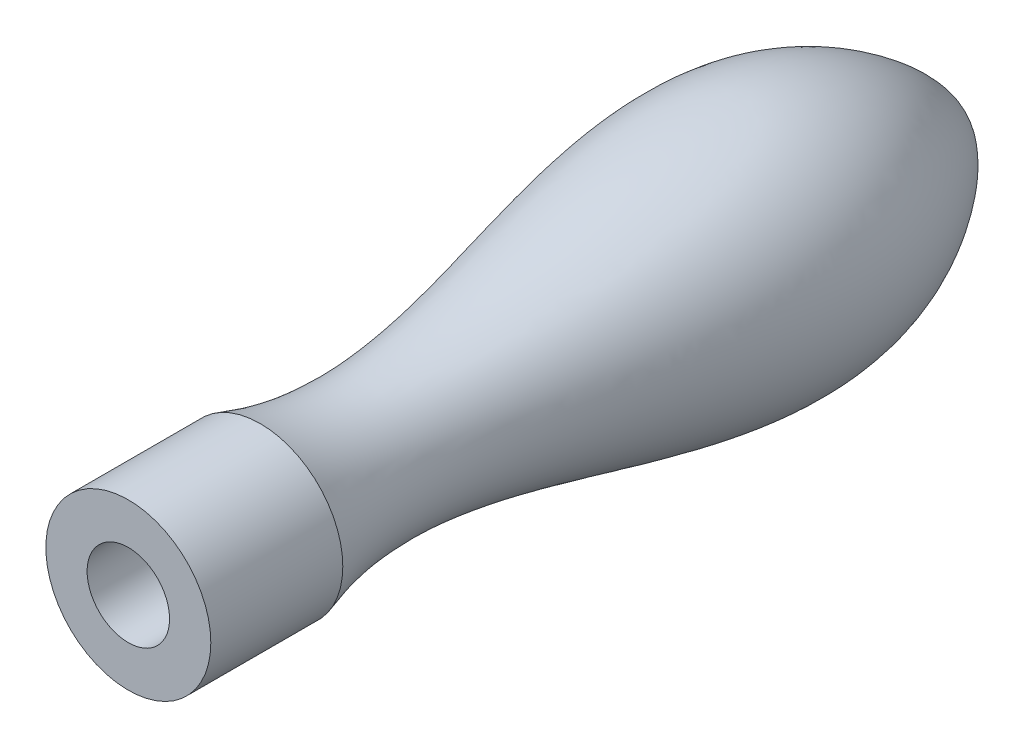
ISO-10303-21;
HEADER;
FILE_DESCRIPTION(('STEP AP214'),'2;1');
FILE_NAME('part.step','',(''),(''),'','','');
FILE_SCHEMA(('AUTOMOTIVE_DESIGN { 1 0 10303 214 1 1 1 1 }'));
ENDSEC;
DATA;
#1=APPLICATION_CONTEXT('core data for automotive mechanical design processes');
#2=APPLICATION_PROTOCOL_DEFINITION('international standard','automotive_design',2000,#1);
#3=PRODUCT_CONTEXT('',#1,'mechanical');
#4=PRODUCT('Part','Part','',(#3));
#5=PRODUCT_RELATED_PRODUCT_CATEGORY('part','',(#4));
#6=PRODUCT_DEFINITION_FORMATION('','',#4);
#7=PRODUCT_DEFINITION_CONTEXT('part definition',#1,'design');
#8=PRODUCT_DEFINITION('design','',#6,#7);
#9=PRODUCT_DEFINITION_SHAPE('','',#8);
#10=(LENGTH_UNIT() NAMED_UNIT(*) SI_UNIT(.MILLI.,.METRE.));
#11=(NAMED_UNIT(*) PLANE_ANGLE_UNIT() SI_UNIT($,.RADIAN.));
#12=(NAMED_UNIT(*) SI_UNIT($,.STERADIAN.) SOLID_ANGLE_UNIT());
#13=UNCERTAINTY_MEASURE_WITH_UNIT(LENGTH_MEASURE(1.E-05),#10,'distance_accuracy_value','');
#14=(GEOMETRIC_REPRESENTATION_CONTEXT(3) GLOBAL_UNCERTAINTY_ASSIGNED_CONTEXT((#13)) GLOBAL_UNIT_ASSIGNED_CONTEXT((#10,
#11,#12)) REPRESENTATION_CONTEXT('',''));
#15=CARTESIAN_POINT('',(0.,0.,0.));
#16=DIRECTION('',(0.,0.,1.));
#17=DIRECTION('',(1.,0.,0.));
#18=AXIS2_PLACEMENT_3D('',#15,#16,#17);
#19=CARTESIAN_POINT('',(0.,0.,-16.));
#20=DIRECTION('',(0.,0.,-1.));
#21=DIRECTION('',(-1.,0.,0.));
#22=AXIS2_PLACEMENT_3D('',#19,#20,#21);
#23=TOROIDAL_SURFACE('',#22,5.5,1.2);
#24=CARTESIAN_POINT('',(-2.74999999999999,4.76313972081442,-16.));
#25=DIRECTION('',(0.86602540378444,0.499999999999998,0.));
#26=DIRECTION('',(-0.499999999999998,0.86602540378444,0.));
#27=AXIS2_PLACEMENT_3D('',#24,#25,#26);
#28=CIRCLE('',#27,1.2);
#29=CARTESIAN_POINT('',(-3.34999999999999,5.80237020535575,-16.));
#30=VERTEX_POINT('',#29);
#31=EDGE_CURVE('E11',#30,#30,#28,.F.);
#32=CARTESIAN_POINT('',(-5.31259204458987,1.42350474806387,-16.));
#33=DIRECTION('',(0.258819045102521,0.965925826289068,0.));
#34=DIRECTION('',(-0.965925826289068,0.258819045102521,0.));
#35=AXIS2_PLACEMENT_3D('',#32,#33,#34);
#36=CIRCLE('',#35,1.2);
#37=CARTESIAN_POINT('',(-6.47170303613676,1.73408760218689,-16.));
#38=VERTEX_POINT('',#37);
#39=EDGE_CURVE('E59',#38,#38,#36,.F.);
#40=CARTESIAN_POINT('',(0.,0.,-16.));
#41=DIRECTION('',(0.,0.,-1.));
#42=DIRECTION('',(-1.,0.,0.));
#43=AXIS2_PLACEMENT_3D('',#40,#41,#42);
#44=CIRCLE('',#43,6.7);
#45=EDGE_CURVE('',#30,#38,#44,.T.);
#46=ORIENTED_EDGE('',*,*,#31,.F.);
#47=ORIENTED_EDGE('',*,*,#39,.T.);
#48=ORIENTED_EDGE('',*,*,#45,.T.);
#49=ORIENTED_EDGE('',*,*,#45,.F.);
#50=EDGE_LOOP('',(#46,#48,#47,#49));
#51=FACE_BOUND('',#50,.T.);
#52=ADVANCED_FACE('F53',(#51),#23,.T.);
#53=CARTESIAN_POINT('',(0.,0.,-17.2));
#54=DIRECTION('',(0.258819045102521,0.965925826289068,0.));
#55=DIRECTION('',(-0.965925826289068,0.258819045102521,0.));
#56=AXIS2_PLACEMENT_3D('',#53,#54,#55);
#57=PLANE('',#56);
#58=ORIENTED_EDGE('',*,*,#39,.F.);
#59=EDGE_LOOP('',(#58));
#60=FACE_BOUND('',#59,.T.);
#61=ADVANCED_FACE('F66',(#60),#57,.T.);
#62=CARTESIAN_POINT('',(0.,0.,-17.2));
#63=DIRECTION('',(0.86602540378444,0.499999999999998,0.));
#64=DIRECTION('',(-0.499999999999998,0.86602540378444,0.));
#65=AXIS2_PLACEMENT_3D('',#62,#63,#64);
#66=PLANE('',#65);
#67=ORIENTED_EDGE('',*,*,#31,.T.);
#68=EDGE_LOOP('',(#67));
#69=FACE_BOUND('',#68,.T.);
#70=ADVANCED_FACE('F68',(#69),#66,.F.);
#71=CLOSED_SHELL('',(#52,#61,#70));
#72=MANIFOLD_SOLID_BREP('B2',#71);
#73=CARTESIAN_POINT('',(0.,0.,0.));
#74=DIRECTION('',(0.,0.,1.));
#75=DIRECTION('',(0.,-1.,0.));
#76=AXIS2_PLACEMENT_3D('',#73,#74,#75);
#77=CYLINDRICAL_SURFACE('',#76,5.);
#78=CARTESIAN_POINT('',(0.,0.,0.));
#79=DIRECTION('',(0.,0.,1.));
#80=DIRECTION('',(0.,-1.,0.));
#81=AXIS2_PLACEMENT_3D('',#78,#79,#80);
#82=CIRCLE('',#81,5.);
#83=CARTESIAN_POINT('',(0.,-5.,0.));
#84=VERTEX_POINT('',#83);
#85=EDGE_CURVE('E172',#84,#84,#82,.T.);
#86=ORIENTED_EDGE('',*,*,#85,.T.);
#87=EDGE_LOOP('',(#86));
#88=FACE_BOUND('',#87,.T.);
#89=CARTESIAN_POINT('',(0.,0.,-14.8));
#90=DIRECTION('',(0.,0.,-1.));
#91=DIRECTION('',(-1.,0.,0.));
#92=AXIS2_PLACEMENT_3D('',#89,#90,#91);
#93=CIRCLE('',#92,5.);
#94=CARTESIAN_POINT('',(-5.,0.,-14.8));
#95=VERTEX_POINT('',#94);
#96=EDGE_CURVE('E107',#95,#95,#93,.T.);
#97=ORIENTED_EDGE('',*,*,#96,.T.);
#98=EDGE_LOOP('',(#97));
#99=FACE_BOUND('',#98,.T.);
#100=ADVANCED_FACE('F103',(#88,#99),#77,.F.);
#101=CARTESIAN_POINT('',(0.,0.,0.));
#102=DIRECTION('',(0.,0.,-1.));
#103=DIRECTION('',(-1.,0.,0.));
#104=AXIS2_PLACEMENT_3D('',#101,#102,#103);
#105=PLANE('',#104);
#106=ORIENTED_EDGE('',*,*,#85,.F.);
#107=EDGE_LOOP('',(#106));
#108=FACE_BOUND('',#107,.T.);
#109=CARTESIAN_POINT('',(0.,0.,0.));
#110=DIRECTION('',(0.,0.,1.));
#111=DIRECTION('',(1.,0.,0.));
#112=AXIS2_PLACEMENT_3D('',#109,#110,#111);
#113=CIRCLE('',#112,10.);
#114=CARTESIAN_POINT('',(10.,0.,0.));
#115=VERTEX_POINT('',#114);
#116=EDGE_CURVE('E51',#115,#115,#113,.T.);
#117=ORIENTED_EDGE('',*,*,#116,.T.);
#118=EDGE_LOOP('',(#117));
#119=FACE_BOUND('',#118,.T.);
#120=ADVANCED_FACE('F105',(#108,#119),#105,.F.);
#121=CARTESIAN_POINT('',(0.,0.,0.));
#122=DIRECTION('',(0.,0.,1.));
#123=DIRECTION('',(1.,0.,0.));
#124=AXIS2_PLACEMENT_3D('',#121,#122,#123);
#125=CYLINDRICAL_SURFACE('',#124,10.);
#126=ORIENTED_EDGE('',*,*,#116,.F.);
#127=EDGE_LOOP('',(#126));
#128=FACE_BOUND('',#127,.T.);
#129=CARTESIAN_POINT('',(0.,0.,-16.));
#130=DIRECTION('',(0.,0.,1.));
#131=DIRECTION('',(1.,0.,0.));
#132=AXIS2_PLACEMENT_3D('',#129,#130,#131);
#133=CIRCLE('',#132,10.);
#134=CARTESIAN_POINT('',(10.,0.,-16.));
#135=VERTEX_POINT('',#134);
#136=EDGE_CURVE('E113',#135,#135,#133,.T.);
#137=ORIENTED_EDGE('',*,*,#136,.T.);
#138=EDGE_LOOP('',(#137));
#139=FACE_BOUND('',#138,.T.);
#140=ADVANCED_FACE('F142',(#128,#139),#125,.T.);
#141=CARTESIAN_POINT('',(0.,0.,-100.));
#142=CARTESIAN_POINT('',(0.,3.71466958429243,-100.000000000636));
#143=CARTESIAN_POINT('',(0.,13.9735481088506,-89.0909214551898));
#144=CARTESIAN_POINT('',(0.,17.8807413361474,-59.3547047090152));
#145=CARTESIAN_POINT('',(0.,3.79335247692303,-34.1238889749349));
#146=CARTESIAN_POINT('',(0.,10.,-16.));
#147=B_SPLINE_CURVE_WITH_KNOTS('',3,(#141,#142,#143,#144,#145,#146),.UNSPECIFIED.,.F.,.F.,(4,1,
1,4),(0.,0.0710532239999732,0.196229133534261,0.500000000005717),.UNSPECIFIED.);
#148=CARTESIAN_POINT('',(0.,0.,0.));
#149=DIRECTION('',(0.,0.,1.));
#150=AXIS1_PLACEMENT('',#148,#149);
#151=SURFACE_OF_REVOLUTION('',#147,#150);
#152=ORIENTED_EDGE('',*,*,#136,.F.);
#153=EDGE_LOOP('',(#152));
#154=FACE_BOUND('',#153,.T.);
#155=CARTESIAN_POINT('',(0.,0.,-100.));
#156=VERTEX_POINT('',#155);
#157=VERTEX_LOOP('',#156);
#158=FACE_BOUND('',#157,.T.);
#159=ADVANCED_FACE('F150',(#154,#158),#151,.T.);
#160=CARTESIAN_POINT('',(0.,0.,-16.));
#161=DIRECTION('',(0.,0.,1.));
#162=DIRECTION('',(1.,0.,0.));
#163=AXIS2_PLACEMENT_3D('',#160,#161,#162);
#164=TOROIDAL_SURFACE('',#163,6.,1.2);
#165=CARTESIAN_POINT('',(0.,0.,-14.8));
#166=DIRECTION('',(0.,0.,1.));
#167=DIRECTION('',(1.,0.,0.));
#168=AXIS2_PLACEMENT_3D('',#165,#166,#167);
#169=CIRCLE('',#168,6.);
#170=CARTESIAN_POINT('',(6.,0.,-14.8));
#171=VERTEX_POINT('',#170);
#172=EDGE_CURVE('E161',#171,#171,#169,.T.);
#173=ORIENTED_EDGE('',*,*,#172,.T.);
#174=EDGE_LOOP('',(#173));
#175=FACE_BOUND('',#174,.T.);
#176=CARTESIAN_POINT('',(0.,0.,-17.2));
#177=DIRECTION('',(0.,0.,1.));
#178=DIRECTION('',(1.,0.,0.));
#179=AXIS2_PLACEMENT_3D('',#176,#177,#178);
#180=CIRCLE('',#179,6.);
#181=CARTESIAN_POINT('',(6.,0.,-17.2));
#182=VERTEX_POINT('',#181);
#183=EDGE_CURVE('E164',#182,#182,#180,.T.);
#184=ORIENTED_EDGE('',*,*,#183,.F.);
#185=EDGE_LOOP('',(#184));
#186=FACE_BOUND('',#185,.T.);
#187=ADVANCED_FACE('F147',(#175,#186),#164,.F.);
#188=CARTESIAN_POINT('',(0.,6.,-14.8));
#189=DIRECTION('',(0.,0.,-1.));
#190=DIRECTION('',(-1.,0.,0.));
#191=AXIS2_PLACEMENT_3D('',#188,#189,#190);
#192=PLANE('',#191);
#193=ORIENTED_EDGE('',*,*,#96,.F.);
#194=EDGE_LOOP('',(#193));
#195=FACE_BOUND('',#194,.T.);
#196=ORIENTED_EDGE('',*,*,#172,.F.);
#197=EDGE_LOOP('',(#196));
#198=FACE_BOUND('',#197,.T.);
#199=ADVANCED_FACE('F132',(#195,#198),#192,.T.);
#200=CARTESIAN_POINT('',(0.,6.,-17.2));
#201=DIRECTION('',(0.,0.,1.));
#202=DIRECTION('',(1.,0.,0.));
#203=AXIS2_PLACEMENT_3D('',#200,#201,#202);
#204=PLANE('',#203);
#205=CARTESIAN_POINT('',(0.,0.,-17.2));
#206=DIRECTION('',(0.,0.,1.));
#207=DIRECTION('',(1.,0.,0.));
#208=AXIS2_PLACEMENT_3D('',#205,#206,#207);
#209=CIRCLE('',#208,5.);
#210=CARTESIAN_POINT('',(5.,0.,-17.2));
#211=VERTEX_POINT('',#210);
#212=EDGE_CURVE('E163',#211,#211,#209,.T.);
#213=ORIENTED_EDGE('',*,*,#212,.F.);
#214=EDGE_LOOP('',(#213));
#215=FACE_BOUND('',#214,.T.);
#216=ORIENTED_EDGE('',*,*,#183,.T.);
#217=EDGE_LOOP('',(#216));
#218=FACE_BOUND('',#217,.T.);
#219=ADVANCED_FACE('F123',(#215,#218),#204,.T.);
#220=CARTESIAN_POINT('',(0.,0.,-82.8867513459481));
#221=DIRECTION('',(0.,0.,1.));
#222=DIRECTION('',(0.,-1.,0.));
#223=AXIS2_PLACEMENT_3D('',#220,#221,#222);
#224=CONICAL_SURFACE('',#223,0.,1.0471975511966);
#225=CARTESIAN_POINT('',(0.,0.,-80.));
#226=DIRECTION('',(0.,0.,1.));
#227=DIRECTION('',(0.,-1.,0.));
#228=AXIS2_PLACEMENT_3D('',#225,#226,#227);
#229=CIRCLE('',#228,4.99999999999999);
#230=CARTESIAN_POINT('',(0.,-4.99999999999999,-80.));
#231=VERTEX_POINT('',#230);
#232=EDGE_CURVE('E175',#231,#231,#229,.T.);
#233=ORIENTED_EDGE('',*,*,#232,.T.);
#234=EDGE_LOOP('',(#233));
#235=FACE_BOUND('',#234,.T.);
#236=CARTESIAN_POINT('',(0.,0.,-82.8867513459481));
#237=VERTEX_POINT('',#236);
#238=VERTEX_LOOP('',#237);
#239=FACE_BOUND('',#238,.T.);
#240=ADVANCED_FACE('F120',(#235,#239),#224,.F.);
#241=ORIENTED_EDGE('',*,*,#232,.F.);
#242=EDGE_LOOP('',(#241));
#243=FACE_BOUND('',#242,.T.);
#244=ORIENTED_EDGE('',*,*,#212,.T.);
#245=EDGE_LOOP('',(#244));
#246=FACE_BOUND('',#245,.T.);
#247=ADVANCED_FACE('F122',(#243,#246),#77,.F.);
#248=CLOSED_SHELL('',(#100,#120,#140,#159,#187,#199,#219,#240,#247));
#249=MANIFOLD_SOLID_BREP('B6',#248);
#250=ADVANCED_BREP_SHAPE_REPRESENTATION('',(#18,#72,#249),#14);
#251=SHAPE_DEFINITION_REPRESENTATION(#9,#250);
ENDSEC;
END-ISO-10303-21;
